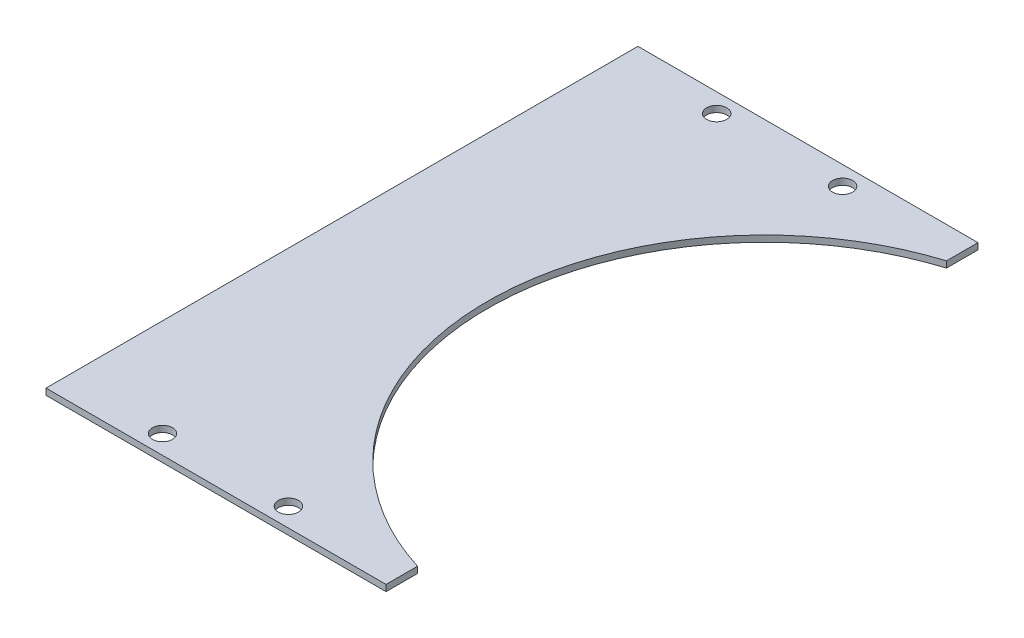
ISO-10303-21;
HEADER;
FILE_DESCRIPTION(('STEP AP214'),'2;1');
FILE_NAME('part.step','',(''),(''),'','','');
FILE_SCHEMA(('AUTOMOTIVE_DESIGN { 1 0 10303 214 1 1 1 1 }'));
ENDSEC;
DATA;
#1=APPLICATION_CONTEXT('core data for automotive mechanical design processes');
#2=APPLICATION_PROTOCOL_DEFINITION('international standard','automotive_design',2000,#1);
#3=PRODUCT_CONTEXT('',#1,'mechanical');
#4=PRODUCT('Part','Part','',(#3));
#5=PRODUCT_RELATED_PRODUCT_CATEGORY('part','',(#4));
#6=PRODUCT_DEFINITION_FORMATION('','',#4);
#7=PRODUCT_DEFINITION_CONTEXT('part definition',#1,'design');
#8=PRODUCT_DEFINITION('design','',#6,#7);
#9=PRODUCT_DEFINITION_SHAPE('','',#8);
#10=(LENGTH_UNIT() NAMED_UNIT(*) SI_UNIT(.MILLI.,.METRE.));
#11=(NAMED_UNIT(*) PLANE_ANGLE_UNIT() SI_UNIT($,.RADIAN.));
#12=(NAMED_UNIT(*) SI_UNIT($,.STERADIAN.) SOLID_ANGLE_UNIT());
#13=UNCERTAINTY_MEASURE_WITH_UNIT(LENGTH_MEASURE(1.E-05),#10,'distance_accuracy_value','');
#14=(GEOMETRIC_REPRESENTATION_CONTEXT(3) GLOBAL_UNCERTAINTY_ASSIGNED_CONTEXT((#13)) GLOBAL_UNIT_ASSIGNED_CONTEXT((#10,
#11,#12)) REPRESENTATION_CONTEXT('',''));
#15=CARTESIAN_POINT('',(0.,0.,0.));
#16=DIRECTION('',(0.,0.,1.));
#17=DIRECTION('',(1.,0.,0.));
#18=AXIS2_PLACEMENT_3D('',#15,#16,#17);
#19=CARTESIAN_POINT('',(67.114877048604,1.,0.));
#20=DIRECTION('',(0.,-1.,0.));
#21=DIRECTION('',(0.,0.,-1.));
#22=AXIS2_PLACEMENT_3D('',#19,#20,#21);
#23=CYLINDRICAL_SURFACE('',#22,44.);
#24=CARTESIAN_POINT('',(67.114877048604,0.,0.));
#25=DIRECTION('',(0.,-1.,0.));
#26=DIRECTION('',(0.,0.,1.));
#27=AXIS2_PLACEMENT_3D('',#24,#25,#26);
#28=CIRCLE('',#27,44.);
#29=CARTESIAN_POINT('',(54.,0.,42.));
#30=VERTEX_POINT('',#29);
#31=CARTESIAN_POINT('',(54.,0.,-42.));
#32=VERTEX_POINT('',#31);
#33=EDGE_CURVE('E120',#30,#32,#28,.T.);
#34=ORIENTED_EDGE('',*,*,#33,.T.);
#35=DIRECTION('',(0.,-1.,0.));
#36=VECTOR('',#35,1.);
#37=CARTESIAN_POINT('',(54.,1.,-42.));
#38=LINE('',#37,#36);
#39=CARTESIAN_POINT('',(54.,1.,-42.));
#40=VERTEX_POINT('',#39);
#41=EDGE_CURVE('E11',#40,#32,#38,.T.);
#42=ORIENTED_EDGE('',*,*,#41,.F.);
#43=CARTESIAN_POINT('',(67.114877048604,1.,0.));
#44=DIRECTION('',(0.,-1.,0.));
#45=DIRECTION('',(0.,0.,1.));
#46=AXIS2_PLACEMENT_3D('',#43,#44,#45);
#47=CIRCLE('',#46,44.);
#48=CARTESIAN_POINT('',(54.,1.,42.));
#49=VERTEX_POINT('',#48);
#50=EDGE_CURVE('E130',#49,#40,#47,.T.);
#51=ORIENTED_EDGE('',*,*,#50,.F.);
#52=DIRECTION('',(0.,-1.,0.));
#53=VECTOR('',#52,1.);
#54=CARTESIAN_POINT('',(54.,1.,42.));
#55=LINE('',#54,#53);
#56=EDGE_CURVE('E116',#49,#30,#55,.T.);
#57=ORIENTED_EDGE('',*,*,#56,.T.);
#58=EDGE_LOOP('',(#34,#42,#51,#57));
#59=FACE_BOUND('',#58,.T.);
#60=ADVANCED_FACE('F34',(#59),#23,.F.);
#61=CARTESIAN_POINT('',(54.,1.,-47.));
#62=DIRECTION('',(-1.,0.,0.));
#63=DIRECTION('',(0.,0.,1.));
#64=AXIS2_PLACEMENT_3D('',#61,#62,#63);
#65=PLANE('',#64);
#66=DIRECTION('',(0.,0.,-1.));
#67=VECTOR('',#66,1.);
#68=CARTESIAN_POINT('',(54.,0.,-47.));
#69=LINE('',#68,#67);
#70=CARTESIAN_POINT('',(54.,0.,-47.));
#71=VERTEX_POINT('',#70);
#72=EDGE_CURVE('E123',#32,#71,#69,.T.);
#73=ORIENTED_EDGE('',*,*,#72,.T.);
#74=DIRECTION('',(0.,-1.,0.));
#75=VECTOR('',#74,1.);
#76=CARTESIAN_POINT('',(54.,1.,-47.));
#77=LINE('',#76,#75);
#78=CARTESIAN_POINT('',(54.,1.,-47.));
#79=VERTEX_POINT('',#78);
#80=EDGE_CURVE('E43',#79,#71,#77,.T.);
#81=ORIENTED_EDGE('',*,*,#80,.F.);
#82=DIRECTION('',(0.,0.,-1.));
#83=VECTOR('',#82,1.);
#84=CARTESIAN_POINT('',(54.,1.,-47.));
#85=LINE('',#84,#83);
#86=EDGE_CURVE('E89',#40,#79,#85,.T.);
#87=ORIENTED_EDGE('',*,*,#86,.F.);
#88=ORIENTED_EDGE('',*,*,#41,.T.);
#89=EDGE_LOOP('',(#73,#81,#87,#88));
#90=FACE_BOUND('',#89,.T.);
#91=ADVANCED_FACE('F165',(#90),#65,.F.);
#92=CARTESIAN_POINT('',(0.,1.,-47.));
#93=DIRECTION('',(0.,0.,1.));
#94=DIRECTION('',(1.,0.,0.));
#95=AXIS2_PLACEMENT_3D('',#92,#93,#94);
#96=PLANE('',#95);
#97=DIRECTION('',(-1.,0.,0.));
#98=VECTOR('',#97,1.);
#99=CARTESIAN_POINT('',(0.,0.,-47.));
#100=LINE('',#99,#98);
#101=CARTESIAN_POINT('',(0.,0.,-47.));
#102=VERTEX_POINT('',#101);
#103=EDGE_CURVE('E125',#71,#102,#100,.T.);
#104=ORIENTED_EDGE('',*,*,#103,.T.);
#105=DIRECTION('',(0.,-1.,0.));
#106=VECTOR('',#105,1.);
#107=CARTESIAN_POINT('',(0.,1.,-47.));
#108=LINE('',#107,#106);
#109=CARTESIAN_POINT('',(0.,1.,-47.));
#110=VERTEX_POINT('',#109);
#111=EDGE_CURVE('E111',#110,#102,#108,.T.);
#112=ORIENTED_EDGE('',*,*,#111,.F.);
#113=DIRECTION('',(-1.,0.,0.));
#114=VECTOR('',#113,1.);
#115=CARTESIAN_POINT('',(0.,1.,-47.));
#116=LINE('',#115,#114);
#117=EDGE_CURVE('E102',#79,#110,#116,.T.);
#118=ORIENTED_EDGE('',*,*,#117,.F.);
#119=ORIENTED_EDGE('',*,*,#80,.T.);
#120=EDGE_LOOP('',(#104,#112,#118,#119));
#121=FACE_BOUND('',#120,.T.);
#122=ADVANCED_FACE('F170',(#121),#96,.F.);
#123=CARTESIAN_POINT('',(0.,1.,47.));
#124=DIRECTION('',(1.,0.,0.));
#125=DIRECTION('',(0.,0.,-1.));
#126=AXIS2_PLACEMENT_3D('',#123,#124,#125);
#127=PLANE('',#126);
#128=DIRECTION('',(0.,0.,1.));
#129=VECTOR('',#128,1.);
#130=CARTESIAN_POINT('',(0.,0.,47.));
#131=LINE('',#130,#129);
#132=CARTESIAN_POINT('',(0.,0.,47.));
#133=VERTEX_POINT('',#132);
#134=EDGE_CURVE('E110',#102,#133,#131,.T.);
#135=ORIENTED_EDGE('',*,*,#134,.T.);
#136=DIRECTION('',(0.,-1.,0.));
#137=VECTOR('',#136,1.);
#138=CARTESIAN_POINT('',(0.,1.,47.));
#139=LINE('',#138,#137);
#140=CARTESIAN_POINT('',(0.,1.,47.));
#141=VERTEX_POINT('',#140);
#142=EDGE_CURVE('E107',#141,#133,#139,.T.);
#143=ORIENTED_EDGE('',*,*,#142,.F.);
#144=DIRECTION('',(0.,0.,1.));
#145=VECTOR('',#144,1.);
#146=CARTESIAN_POINT('',(0.,1.,47.));
#147=LINE('',#146,#145);
#148=EDGE_CURVE('E96',#110,#141,#147,.T.);
#149=ORIENTED_EDGE('',*,*,#148,.F.);
#150=ORIENTED_EDGE('',*,*,#111,.T.);
#151=EDGE_LOOP('',(#135,#143,#149,#150));
#152=FACE_BOUND('',#151,.T.);
#153=ADVANCED_FACE('F108',(#152),#127,.F.);
#154=CARTESIAN_POINT('',(54.,1.,47.));
#155=DIRECTION('',(0.,0.,-1.));
#156=DIRECTION('',(-1.,0.,0.));
#157=AXIS2_PLACEMENT_3D('',#154,#155,#156);
#158=PLANE('',#157);
#159=DIRECTION('',(1.,0.,0.));
#160=VECTOR('',#159,1.);
#161=CARTESIAN_POINT('',(54.,0.,47.));
#162=LINE('',#161,#160);
#163=CARTESIAN_POINT('',(54.,0.,47.));
#164=VERTEX_POINT('',#163);
#165=EDGE_CURVE('E75',#133,#164,#162,.T.);
#166=ORIENTED_EDGE('',*,*,#165,.T.);
#167=DIRECTION('',(0.,-1.,0.));
#168=VECTOR('',#167,1.);
#169=CARTESIAN_POINT('',(54.,1.,47.));
#170=LINE('',#169,#168);
#171=CARTESIAN_POINT('',(54.,1.,47.));
#172=VERTEX_POINT('',#171);
#173=EDGE_CURVE('E112',#172,#164,#170,.T.);
#174=ORIENTED_EDGE('',*,*,#173,.F.);
#175=DIRECTION('',(1.,0.,0.));
#176=VECTOR('',#175,1.);
#177=CARTESIAN_POINT('',(54.,1.,47.));
#178=LINE('',#177,#176);
#179=EDGE_CURVE('E100',#141,#172,#178,.T.);
#180=ORIENTED_EDGE('',*,*,#179,.F.);
#181=ORIENTED_EDGE('',*,*,#142,.T.);
#182=EDGE_LOOP('',(#166,#174,#180,#181));
#183=FACE_BOUND('',#182,.T.);
#184=ADVANCED_FACE('F114',(#183),#158,.F.);
#185=CARTESIAN_POINT('',(54.,1.,42.));
#186=DIRECTION('',(-1.,0.,0.));
#187=DIRECTION('',(0.,0.,1.));
#188=AXIS2_PLACEMENT_3D('',#185,#186,#187);
#189=PLANE('',#188);
#190=DIRECTION('',(0.,0.,-1.));
#191=VECTOR('',#190,1.);
#192=CARTESIAN_POINT('',(54.,0.,42.));
#193=LINE('',#192,#191);
#194=EDGE_CURVE('E81',#164,#30,#193,.T.);
#195=ORIENTED_EDGE('',*,*,#194,.T.);
#196=ORIENTED_EDGE('',*,*,#56,.F.);
#197=DIRECTION('',(0.,0.,-1.));
#198=VECTOR('',#197,1.);
#199=CARTESIAN_POINT('',(54.,1.,42.));
#200=LINE('',#199,#198);
#201=EDGE_CURVE('E52',#172,#49,#200,.T.);
#202=ORIENTED_EDGE('',*,*,#201,.F.);
#203=ORIENTED_EDGE('',*,*,#173,.T.);
#204=EDGE_LOOP('',(#195,#196,#202,#203));
#205=FACE_BOUND('',#204,.T.);
#206=ADVANCED_FACE('F195',(#205),#189,.F.);
#207=CARTESIAN_POINT('',(67.114877048604,1.,0.));
#208=DIRECTION('',(0.,1.,0.));
#209=DIRECTION('',(0.,0.,1.));
#210=AXIS2_PLACEMENT_3D('',#207,#208,#209);
#211=PLANE('',#210);
#212=CARTESIAN_POINT('',(35.5,1.,-44.));
#213=DIRECTION('',(0.,1.,0.));
#214=DIRECTION('',(0.,0.,1.));
#215=AXIS2_PLACEMENT_3D('',#212,#213,#214);
#216=CIRCLE('',#215,1.6);
#217=CARTESIAN_POINT('',(35.5,1.,-42.4));
#218=VERTEX_POINT('',#217);
#219=EDGE_CURVE('E182',#218,#218,#216,.T.);
#220=ORIENTED_EDGE('',*,*,#219,.F.);
#221=EDGE_LOOP('',(#220));
#222=FACE_BOUND('',#221,.T.);
#223=CARTESIAN_POINT('',(15.5,1.,44.));
#224=DIRECTION('',(0.,1.,0.));
#225=DIRECTION('',(0.,0.,-1.));
#226=AXIS2_PLACEMENT_3D('',#223,#224,#225);
#227=CIRCLE('',#226,1.6);
#228=CARTESIAN_POINT('',(15.5,1.,42.4));
#229=VERTEX_POINT('',#228);
#230=EDGE_CURVE('E183',#229,#229,#227,.T.);
#231=ORIENTED_EDGE('',*,*,#230,.F.);
#232=EDGE_LOOP('',(#231));
#233=FACE_BOUND('',#232,.T.);
#234=CARTESIAN_POINT('',(35.5,1.,44.));
#235=DIRECTION('',(0.,1.,0.));
#236=DIRECTION('',(0.,0.,-1.));
#237=AXIS2_PLACEMENT_3D('',#234,#235,#236);
#238=CIRCLE('',#237,1.6);
#239=CARTESIAN_POINT('',(35.5,1.,42.4));
#240=VERTEX_POINT('',#239);
#241=EDGE_CURVE('E186',#240,#240,#238,.T.);
#242=ORIENTED_EDGE('',*,*,#241,.F.);
#243=EDGE_LOOP('',(#242));
#244=FACE_BOUND('',#243,.T.);
#245=CARTESIAN_POINT('',(15.5,1.,-44.));
#246=DIRECTION('',(0.,1.,0.));
#247=DIRECTION('',(0.,0.,1.));
#248=AXIS2_PLACEMENT_3D('',#245,#246,#247);
#249=CIRCLE('',#248,1.6);
#250=CARTESIAN_POINT('',(15.5,1.,-42.4));
#251=VERTEX_POINT('',#250);
#252=EDGE_CURVE('E140',#251,#251,#249,.T.);
#253=ORIENTED_EDGE('',*,*,#252,.F.);
#254=EDGE_LOOP('',(#253));
#255=FACE_BOUND('',#254,.T.);
#256=ORIENTED_EDGE('',*,*,#50,.T.);
#257=ORIENTED_EDGE('',*,*,#86,.T.);
#258=ORIENTED_EDGE('',*,*,#117,.T.);
#259=ORIENTED_EDGE('',*,*,#148,.T.);
#260=ORIENTED_EDGE('',*,*,#179,.T.);
#261=ORIENTED_EDGE('',*,*,#201,.T.);
#262=EDGE_LOOP('',(#256,#257,#258,#259,#260,#261));
#263=FACE_BOUND('',#262,.T.);
#264=ADVANCED_FACE('F98',(#222,#233,#244,#255,#263),#211,.T.);
#265=CARTESIAN_POINT('',(67.114877048604,0.,0.));
#266=DIRECTION('',(0.,1.,0.));
#267=DIRECTION('',(0.,0.,1.));
#268=AXIS2_PLACEMENT_3D('',#265,#266,#267);
#269=PLANE('',#268);
#270=CARTESIAN_POINT('',(35.5,0.,-44.));
#271=DIRECTION('',(0.,1.,0.));
#272=DIRECTION('',(0.,0.,1.));
#273=AXIS2_PLACEMENT_3D('',#270,#271,#272);
#274=CIRCLE('',#273,1.6);
#275=CARTESIAN_POINT('',(35.5,0.,-42.4));
#276=VERTEX_POINT('',#275);
#277=EDGE_CURVE('E37',#276,#276,#274,.T.);
#278=ORIENTED_EDGE('',*,*,#277,.T.);
#279=EDGE_LOOP('',(#278));
#280=FACE_BOUND('',#279,.T.);
#281=CARTESIAN_POINT('',(15.5,0.,44.));
#282=DIRECTION('',(0.,1.,0.));
#283=DIRECTION('',(0.,0.,1.));
#284=AXIS2_PLACEMENT_3D('',#281,#282,#283);
#285=CIRCLE('',#284,1.6);
#286=CARTESIAN_POINT('',(15.5,0.,45.6));
#287=VERTEX_POINT('',#286);
#288=EDGE_CURVE('E142',#287,#287,#285,.T.);
#289=ORIENTED_EDGE('',*,*,#288,.T.);
#290=EDGE_LOOP('',(#289));
#291=FACE_BOUND('',#290,.T.);
#292=CARTESIAN_POINT('',(35.5,0.,44.));
#293=DIRECTION('',(0.,1.,0.));
#294=DIRECTION('',(0.,0.,1.));
#295=AXIS2_PLACEMENT_3D('',#292,#293,#294);
#296=CIRCLE('',#295,1.6);
#297=CARTESIAN_POINT('',(35.5,0.,45.6));
#298=VERTEX_POINT('',#297);
#299=EDGE_CURVE('E139',#298,#298,#296,.T.);
#300=ORIENTED_EDGE('',*,*,#299,.T.);
#301=EDGE_LOOP('',(#300));
#302=FACE_BOUND('',#301,.T.);
#303=CARTESIAN_POINT('',(15.5,0.,-44.));
#304=DIRECTION('',(0.,1.,0.));
#305=DIRECTION('',(0.,0.,1.));
#306=AXIS2_PLACEMENT_3D('',#303,#304,#305);
#307=CIRCLE('',#306,1.6);
#308=CARTESIAN_POINT('',(15.5,0.,-42.4));
#309=VERTEX_POINT('',#308);
#310=EDGE_CURVE('E136',#309,#309,#307,.T.);
#311=ORIENTED_EDGE('',*,*,#310,.T.);
#312=EDGE_LOOP('',(#311));
#313=FACE_BOUND('',#312,.T.);
#314=ORIENTED_EDGE('',*,*,#33,.F.);
#315=ORIENTED_EDGE('',*,*,#194,.F.);
#316=ORIENTED_EDGE('',*,*,#165,.F.);
#317=ORIENTED_EDGE('',*,*,#134,.F.);
#318=ORIENTED_EDGE('',*,*,#103,.F.);
#319=ORIENTED_EDGE('',*,*,#72,.F.);
#320=EDGE_LOOP('',(#314,#315,#316,#317,#318,#319));
#321=FACE_BOUND('',#320,.T.);
#322=ADVANCED_FACE('F149',(#280,#291,#302,#313,#321),#269,.F.);
#323=CARTESIAN_POINT('',(15.5,-9.,-44.));
#324=DIRECTION('',(0.,1.,0.));
#325=DIRECTION('',(0.,0.,1.));
#326=AXIS2_PLACEMENT_3D('',#323,#324,#325);
#327=CYLINDRICAL_SURFACE('',#326,1.6);
#328=ORIENTED_EDGE('',*,*,#252,.T.);
#329=EDGE_LOOP('',(#328));
#330=FACE_BOUND('',#329,.T.);
#331=ORIENTED_EDGE('',*,*,#310,.F.);
#332=EDGE_LOOP('',(#331));
#333=FACE_BOUND('',#332,.T.);
#334=ADVANCED_FACE('F200',(#330,#333),#327,.F.);
#335=CARTESIAN_POINT('',(35.5,-9.,44.));
#336=DIRECTION('',(0.,1.,0.));
#337=DIRECTION('',(0.,0.,1.));
#338=AXIS2_PLACEMENT_3D('',#335,#336,#337);
#339=CYLINDRICAL_SURFACE('',#338,1.6);
#340=ORIENTED_EDGE('',*,*,#241,.T.);
#341=EDGE_LOOP('',(#340));
#342=FACE_BOUND('',#341,.T.);
#343=ORIENTED_EDGE('',*,*,#299,.F.);
#344=EDGE_LOOP('',(#343));
#345=FACE_BOUND('',#344,.T.);
#346=ADVANCED_FACE('F159',(#342,#345),#339,.F.);
#347=CARTESIAN_POINT('',(15.5,-9.,44.));
#348=DIRECTION('',(0.,1.,0.));
#349=DIRECTION('',(0.,0.,1.));
#350=AXIS2_PLACEMENT_3D('',#347,#348,#349);
#351=CYLINDRICAL_SURFACE('',#350,1.6);
#352=ORIENTED_EDGE('',*,*,#230,.T.);
#353=EDGE_LOOP('',(#352));
#354=FACE_BOUND('',#353,.T.);
#355=ORIENTED_EDGE('',*,*,#288,.F.);
#356=EDGE_LOOP('',(#355));
#357=FACE_BOUND('',#356,.T.);
#358=ADVANCED_FACE('F153',(#354,#357),#351,.F.);
#359=CARTESIAN_POINT('',(35.5,-9.,-44.));
#360=DIRECTION('',(0.,1.,0.));
#361=DIRECTION('',(0.,0.,1.));
#362=AXIS2_PLACEMENT_3D('',#359,#360,#361);
#363=CYLINDRICAL_SURFACE('',#362,1.6);
#364=ORIENTED_EDGE('',*,*,#219,.T.);
#365=EDGE_LOOP('',(#364));
#366=FACE_BOUND('',#365,.T.);
#367=ORIENTED_EDGE('',*,*,#277,.F.);
#368=EDGE_LOOP('',(#367));
#369=FACE_BOUND('',#368,.T.);
#370=ADVANCED_FACE('F151',(#366,#369),#363,.F.);
#371=CLOSED_SHELL('',(#60,#91,#122,#153,#184,#206,#264,#322,#334,#346,#358,#370));
#372=MANIFOLD_SOLID_BREP('B2',#371);
#373=ADVANCED_BREP_SHAPE_REPRESENTATION('',(#18,#372),#14);
#374=SHAPE_DEFINITION_REPRESENTATION(#9,#373);
ENDSEC;
END-ISO-10303-21;
